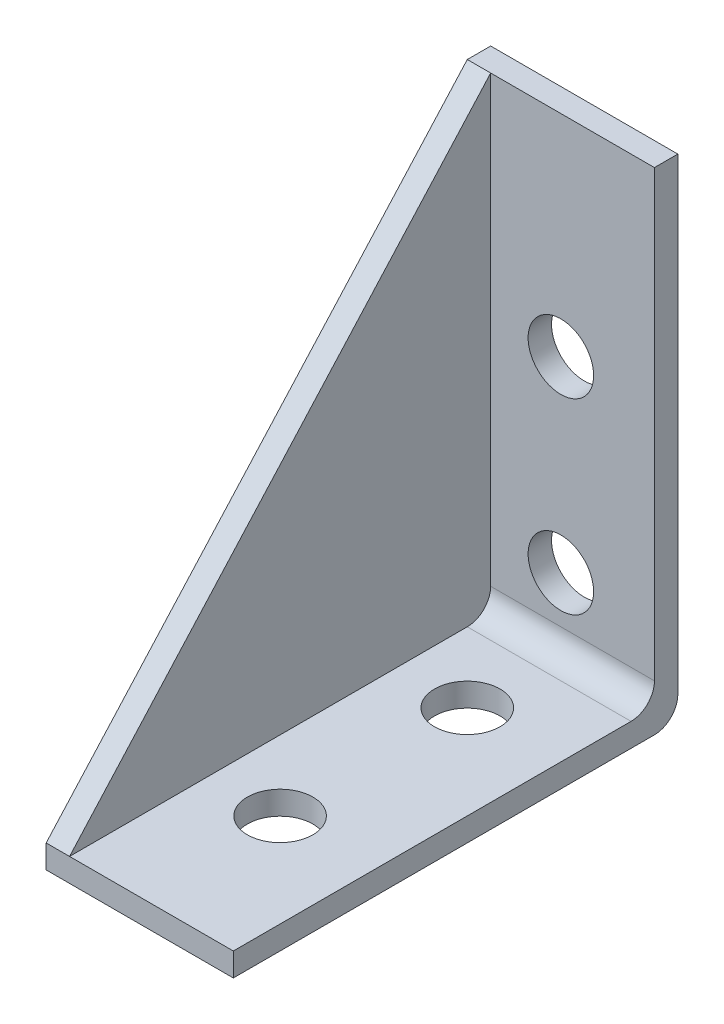
ISO-10303-21;
HEADER;
FILE_DESCRIPTION(('STEP AP214'),'2;1');
FILE_NAME('part.step','',(''),(''),'','','');
FILE_SCHEMA(('AUTOMOTIVE_DESIGN { 1 0 10303 214 1 1 1 1 }'));
ENDSEC;
DATA;
#1=APPLICATION_CONTEXT('core data for automotive mechanical design processes');
#2=APPLICATION_PROTOCOL_DEFINITION('international standard','automotive_design',2000,#1);
#3=PRODUCT_CONTEXT('',#1,'mechanical');
#4=PRODUCT('Part','Part','',(#3));
#5=PRODUCT_RELATED_PRODUCT_CATEGORY('part','',(#4));
#6=PRODUCT_DEFINITION_FORMATION('','',#4);
#7=PRODUCT_DEFINITION_CONTEXT('part definition',#1,'design');
#8=PRODUCT_DEFINITION('design','',#6,#7);
#9=PRODUCT_DEFINITION_SHAPE('','',#8);
#10=(LENGTH_UNIT() NAMED_UNIT(*) SI_UNIT(.MILLI.,.METRE.));
#11=(NAMED_UNIT(*) PLANE_ANGLE_UNIT() SI_UNIT($,.RADIAN.));
#12=(NAMED_UNIT(*) SI_UNIT($,.STERADIAN.) SOLID_ANGLE_UNIT());
#13=UNCERTAINTY_MEASURE_WITH_UNIT(LENGTH_MEASURE(1.E-05),#10,'distance_accuracy_value','');
#14=(GEOMETRIC_REPRESENTATION_CONTEXT(3) GLOBAL_UNCERTAINTY_ASSIGNED_CONTEXT((#13)) GLOBAL_UNIT_ASSIGNED_CONTEXT((#10,
#11,#12)) REPRESENTATION_CONTEXT('',''));
#15=CARTESIAN_POINT('',(0.,0.,0.));
#16=DIRECTION('',(0.,0.,1.));
#17=DIRECTION('',(1.,0.,0.));
#18=AXIS2_PLACEMENT_3D('',#15,#16,#17);
#19=CARTESIAN_POINT('',(0.,0.,5.));
#20=DIRECTION('',(0.,0.,-1.));
#21=DIRECTION('',(-1.,0.,0.));
#22=AXIS2_PLACEMENT_3D('',#19,#20,#21);
#23=PLANE('',#22);
#24=CARTESIAN_POINT('',(20.,20.,5.));
#25=DIRECTION('',(0.,0.,1.));
#26=DIRECTION('',(1.,0.,0.));
#27=AXIS2_PLACEMENT_3D('',#24,#25,#26);
#28=CIRCLE('',#27,7.);
#29=CARTESIAN_POINT('',(27.,20.,5.));
#30=VERTEX_POINT('',#29);
#31=EDGE_CURVE('E254',#30,#30,#28,.T.);
#32=ORIENTED_EDGE('',*,*,#31,.F.);
#33=EDGE_LOOP('',(#32));
#34=FACE_BOUND('',#33,.T.);
#35=CARTESIAN_POINT('',(20.,60.,5.));
#36=DIRECTION('',(0.,0.,1.));
#37=DIRECTION('',(1.,0.,0.));
#38=AXIS2_PLACEMENT_3D('',#35,#36,#37);
#39=CIRCLE('',#38,7.);
#40=CARTESIAN_POINT('',(27.,60.,5.));
#41=VERTEX_POINT('',#40);
#42=EDGE_CURVE('E259',#41,#41,#39,.T.);
#43=ORIENTED_EDGE('',*,*,#42,.F.);
#44=EDGE_LOOP('',(#43));
#45=FACE_BOUND('',#44,.T.);
#46=DIRECTION('',(0.,-1.,0.));
#47=VECTOR('',#46,1.);
#48=CARTESIAN_POINT('',(4.99999999999992,105.,5.));
#49=LINE('',#48,#47);
#50=CARTESIAN_POINT('',(4.99999999999992,105.,5.));
#51=VERTEX_POINT('',#50);
#52=CARTESIAN_POINT('',(4.99999999999995,10.,5.00000000000001));
#53=VERTEX_POINT('',#52);
#54=EDGE_CURVE('E118',#51,#53,#49,.T.);
#55=ORIENTED_EDGE('',*,*,#54,.T.);
#56=DIRECTION('',(-1.,0.,0.));
#57=VECTOR('',#56,1.);
#58=CARTESIAN_POINT('',(40.,10.,5.));
#59=LINE('',#58,#57);
#60=CARTESIAN_POINT('',(40.,10.,5.));
#61=VERTEX_POINT('',#60);
#62=EDGE_CURVE('E131',#53,#61,#59,.F.);
#63=ORIENTED_EDGE('',*,*,#62,.T.);
#64=DIRECTION('',(0.,1.,0.));
#65=VECTOR('',#64,1.);
#66=CARTESIAN_POINT('',(40.,0.,5.));
#67=LINE('',#66,#65);
#68=CARTESIAN_POINT('',(40.,105.,5.));
#69=VERTEX_POINT('',#68);
#70=EDGE_CURVE('E182',#61,#69,#67,.T.);
#71=ORIENTED_EDGE('',*,*,#70,.T.);
#72=DIRECTION('',(1.,0.,0.));
#73=VECTOR('',#72,1.);
#74=CARTESIAN_POINT('',(0.,105.,5.));
#75=LINE('',#74,#73);
#76=EDGE_CURVE('E133',#51,#69,#75,.T.);
#77=ORIENTED_EDGE('',*,*,#76,.F.);
#78=EDGE_LOOP('',(#55,#63,#71,#77));
#79=FACE_BOUND('',#78,.T.);
#80=ADVANCED_FACE('F45',(#34,#45,#79),#23,.F.);
#81=CARTESIAN_POINT('',(0.,5.,95.));
#82=DIRECTION('',(0.,-1.,0.));
#83=DIRECTION('',(0.,0.,-1.));
#84=AXIS2_PLACEMENT_3D('',#81,#82,#83);
#85=PLANE('',#84);
#86=CARTESIAN_POINT('',(20.,5.,25.));
#87=DIRECTION('',(0.,1.,0.));
#88=DIRECTION('',(0.,0.,1.));
#89=AXIS2_PLACEMENT_3D('',#86,#87,#88);
#90=CIRCLE('',#89,7.);
#91=CARTESIAN_POINT('',(20.,4.99999999999999,32.));
#92=VERTEX_POINT('',#91);
#93=EDGE_CURVE('E231',#92,#92,#90,.T.);
#94=ORIENTED_EDGE('',*,*,#93,.F.);
#95=EDGE_LOOP('',(#94));
#96=FACE_BOUND('',#95,.T.);
#97=CARTESIAN_POINT('',(20.,5.,65.));
#98=DIRECTION('',(0.,1.,0.));
#99=DIRECTION('',(0.,0.,1.));
#100=AXIS2_PLACEMENT_3D('',#97,#98,#99);
#101=CIRCLE('',#100,7.);
#102=CARTESIAN_POINT('',(20.,4.99999999999999,72.));
#103=VERTEX_POINT('',#102);
#104=EDGE_CURVE('E223',#103,#103,#101,.T.);
#105=ORIENTED_EDGE('',*,*,#104,.F.);
#106=EDGE_LOOP('',(#105));
#107=FACE_BOUND('',#106,.T.);
#108=DIRECTION('',(0.,0.,1.));
#109=VECTOR('',#108,1.);
#110=CARTESIAN_POINT('',(4.99999999999995,5.,95.));
#111=LINE('',#110,#109);
#112=CARTESIAN_POINT('',(4.99999999999995,5.,10.));
#113=VERTEX_POINT('',#112);
#114=CARTESIAN_POINT('',(4.99999999999995,5.,95.));
#115=VERTEX_POINT('',#114);
#116=EDGE_CURVE('E121',#113,#115,#111,.T.);
#117=ORIENTED_EDGE('',*,*,#116,.T.);
#118=DIRECTION('',(-1.,0.,0.));
#119=VECTOR('',#118,1.);
#120=CARTESIAN_POINT('',(0.,5.,95.));
#121=LINE('',#120,#119);
#122=CARTESIAN_POINT('',(40.,5.,95.));
#123=VERTEX_POINT('',#122);
#124=EDGE_CURVE('E244',#123,#115,#121,.T.);
#125=ORIENTED_EDGE('',*,*,#124,.F.);
#126=DIRECTION('',(0.,0.,-1.));
#127=VECTOR('',#126,1.);
#128=CARTESIAN_POINT('',(40.,5.,95.));
#129=LINE('',#128,#127);
#130=CARTESIAN_POINT('',(40.,5.,10.));
#131=VERTEX_POINT('',#130);
#132=EDGE_CURVE('E250',#123,#131,#129,.T.);
#133=ORIENTED_EDGE('',*,*,#132,.T.);
#134=DIRECTION('',(-1.,0.,0.));
#135=VECTOR('',#134,1.);
#136=CARTESIAN_POINT('',(0.,5.,9.99999999999999));
#137=LINE('',#136,#135);
#138=EDGE_CURVE('E142',#131,#113,#137,.T.);
#139=ORIENTED_EDGE('',*,*,#138,.T.);
#140=EDGE_LOOP('',(#117,#125,#133,#139));
#141=FACE_BOUND('',#140,.T.);
#142=ADVANCED_FACE('F272',(#96,#107,#141),#85,.F.);
#143=CARTESIAN_POINT('',(0.,10.,9.99999999999999));
#144=DIRECTION('',(1.,0.,0.));
#145=DIRECTION('',(0.,0.,-1.));
#146=AXIS2_PLACEMENT_3D('',#143,#144,#145);
#147=CYLINDRICAL_SURFACE('',#146,5.);
#148=CARTESIAN_POINT('',(4.99999999999995,10.,10.));
#149=DIRECTION('',(-1.,0.,0.));
#150=DIRECTION('',(0.,-1.,0.));
#151=AXIS2_PLACEMENT_3D('',#148,#149,#150);
#152=CIRCLE('',#151,5.00000000000001);
#153=EDGE_CURVE('E114',#53,#113,#152,.T.);
#154=ORIENTED_EDGE('',*,*,#153,.T.);
#155=ORIENTED_EDGE('',*,*,#138,.F.);
#156=CARTESIAN_POINT('',(40.,10.,9.99999999999999));
#157=DIRECTION('',(-1.,0.,0.));
#158=DIRECTION('',(0.,-1.,0.));
#159=AXIS2_PLACEMENT_3D('',#156,#157,#158);
#160=CIRCLE('',#159,5.);
#161=EDGE_CURVE('E140',#61,#131,#160,.T.);
#162=ORIENTED_EDGE('',*,*,#161,.F.);
#163=ORIENTED_EDGE('',*,*,#62,.F.);
#164=EDGE_LOOP('',(#154,#155,#162,#163));
#165=FACE_BOUND('',#164,.T.);
#166=ADVANCED_FACE('F139',(#165),#147,.F.);
#167=CARTESIAN_POINT('',(0.,0.,5.));
#168=DIRECTION('',(-1.,0.,0.));
#169=DIRECTION('',(0.,-1.,0.));
#170=AXIS2_PLACEMENT_3D('',#167,#168,#169);
#171=PLANE('',#170);
#172=DIRECTION('',(0.,0.743294146247166,-0.66896473162245));
#173=VECTOR('',#172,1.);
#174=CARTESIAN_POINT('',(0.,105.,5.));
#175=LINE('',#174,#173);
#176=CARTESIAN_POINT('',(0.,5.,95.));
#177=VERTEX_POINT('',#176);
#178=CARTESIAN_POINT('',(0.,105.,5.));
#179=VERTEX_POINT('',#178);
#180=EDGE_CURVE('E136',#177,#179,#175,.T.);
#181=ORIENTED_EDGE('',*,*,#180,.T.);
#182=DIRECTION('',(0.,0.,-1.));
#183=VECTOR('',#182,1.);
#184=CARTESIAN_POINT('',(0.,105.,5.));
#185=LINE('',#184,#183);
#186=CARTESIAN_POINT('',(0.,105.,0.));
#187=VERTEX_POINT('',#186);
#188=EDGE_CURVE('E177',#179,#187,#185,.T.);
#189=ORIENTED_EDGE('',*,*,#188,.T.);
#190=DIRECTION('',(0.,1.,0.));
#191=VECTOR('',#190,1.);
#192=CARTESIAN_POINT('',(0.,0.,0.));
#193=LINE('',#192,#191);
#194=CARTESIAN_POINT('',(0.,5.,0.));
#195=VERTEX_POINT('',#194);
#196=EDGE_CURVE('E195',#195,#187,#193,.T.);
#197=ORIENTED_EDGE('',*,*,#196,.F.);
#198=CARTESIAN_POINT('',(0.,5.,5.));
#199=DIRECTION('',(-1.,0.,0.));
#200=DIRECTION('',(0.,-1.,0.));
#201=AXIS2_PLACEMENT_3D('',#198,#199,#200);
#202=CIRCLE('',#201,5.);
#203=CARTESIAN_POINT('',(0.,0.,5.));
#204=VERTEX_POINT('',#203);
#205=EDGE_CURVE('E11',#195,#204,#202,.T.);
#206=ORIENTED_EDGE('',*,*,#205,.T.);
#207=DIRECTION('',(0.,0.,-1.));
#208=VECTOR('',#207,1.);
#209=CARTESIAN_POINT('',(0.,0.,5.));
#210=LINE('',#209,#208);
#211=CARTESIAN_POINT('',(0.,0.,95.));
#212=VERTEX_POINT('',#211);
#213=EDGE_CURVE('E148',#212,#204,#210,.T.);
#214=ORIENTED_EDGE('',*,*,#213,.F.);
#215=DIRECTION('',(0.,-1.,0.));
#216=VECTOR('',#215,1.);
#217=CARTESIAN_POINT('',(0.,0.,95.));
#218=LINE('',#217,#216);
#219=EDGE_CURVE('E214',#177,#212,#218,.T.);
#220=ORIENTED_EDGE('',*,*,#219,.F.);
#221=EDGE_LOOP('',(#181,#189,#197,#206,#214,#220));
#222=FACE_BOUND('',#221,.T.);
#223=ADVANCED_FACE('F212',(#222),#171,.T.);
#224=CARTESIAN_POINT('',(0.,0.,5.));
#225=DIRECTION('',(0.,1.,0.));
#226=DIRECTION('',(0.,0.,1.));
#227=AXIS2_PLACEMENT_3D('',#224,#225,#226);
#228=PLANE('',#227);
#229=CARTESIAN_POINT('',(20.,0.,65.));
#230=DIRECTION('',(0.,1.,0.));
#231=DIRECTION('',(0.,0.,1.));
#232=AXIS2_PLACEMENT_3D('',#229,#230,#231);
#233=CIRCLE('',#232,7.);
#234=CARTESIAN_POINT('',(20.,0.,72.));
#235=VERTEX_POINT('',#234);
#236=EDGE_CURVE('E227',#235,#235,#233,.T.);
#237=ORIENTED_EDGE('',*,*,#236,.T.);
#238=EDGE_LOOP('',(#237));
#239=FACE_BOUND('',#238,.T.);
#240=CARTESIAN_POINT('',(20.,0.,25.));
#241=DIRECTION('',(0.,1.,0.));
#242=DIRECTION('',(0.,0.,1.));
#243=AXIS2_PLACEMENT_3D('',#240,#241,#242);
#244=CIRCLE('',#243,7.);
#245=CARTESIAN_POINT('',(20.,0.,32.));
#246=VERTEX_POINT('',#245);
#247=EDGE_CURVE('E235',#246,#246,#244,.T.);
#248=ORIENTED_EDGE('',*,*,#247,.T.);
#249=EDGE_LOOP('',(#248));
#250=FACE_BOUND('',#249,.T.);
#251=ORIENTED_EDGE('',*,*,#213,.T.);
#252=DIRECTION('',(1.,0.,0.));
#253=VECTOR('',#252,1.);
#254=CARTESIAN_POINT('',(40.,0.,5.));
#255=LINE('',#254,#253);
#256=CARTESIAN_POINT('',(40.,0.,5.));
#257=VERTEX_POINT('',#256);
#258=EDGE_CURVE('E146',#204,#257,#255,.T.);
#259=ORIENTED_EDGE('',*,*,#258,.T.);
#260=DIRECTION('',(0.,0.,-1.));
#261=VECTOR('',#260,1.);
#262=CARTESIAN_POINT('',(40.,0.,5.));
#263=LINE('',#262,#261);
#264=CARTESIAN_POINT('',(40.,0.,95.));
#265=VERTEX_POINT('',#264);
#266=EDGE_CURVE('E162',#265,#257,#263,.T.);
#267=ORIENTED_EDGE('',*,*,#266,.F.);
#268=DIRECTION('',(1.,0.,0.));
#269=VECTOR('',#268,1.);
#270=CARTESIAN_POINT('',(40.,0.,95.));
#271=LINE('',#270,#269);
#272=EDGE_CURVE('E239',#212,#265,#271,.T.);
#273=ORIENTED_EDGE('',*,*,#272,.F.);
#274=EDGE_LOOP('',(#251,#259,#267,#273));
#275=FACE_BOUND('',#274,.T.);
#276=ADVANCED_FACE('F160',(#239,#250,#275),#228,.F.);
#277=CARTESIAN_POINT('',(40.,0.,5.));
#278=DIRECTION('',(-1.,0.,0.));
#279=DIRECTION('',(0.,-1.,0.));
#280=AXIS2_PLACEMENT_3D('',#277,#278,#279);
#281=PLANE('',#280);
#282=ORIENTED_EDGE('',*,*,#266,.T.);
#283=CARTESIAN_POINT('',(40.,5.,5.));
#284=DIRECTION('',(-1.,0.,0.));
#285=DIRECTION('',(0.,-1.,0.));
#286=AXIS2_PLACEMENT_3D('',#283,#284,#285);
#287=CIRCLE('',#286,5.);
#288=CARTESIAN_POINT('',(40.,5.,0.));
#289=VERTEX_POINT('',#288);
#290=EDGE_CURVE('E68',#257,#289,#287,.F.);
#291=ORIENTED_EDGE('',*,*,#290,.T.);
#292=DIRECTION('',(0.,1.,0.));
#293=VECTOR('',#292,1.);
#294=CARTESIAN_POINT('',(40.,0.,0.));
#295=LINE('',#294,#293);
#296=CARTESIAN_POINT('',(40.,105.,0.));
#297=VERTEX_POINT('',#296);
#298=EDGE_CURVE('E202',#289,#297,#295,.T.);
#299=ORIENTED_EDGE('',*,*,#298,.T.);
#300=DIRECTION('',(0.,0.,-1.));
#301=VECTOR('',#300,1.);
#302=CARTESIAN_POINT('',(40.,105.,5.));
#303=LINE('',#302,#301);
#304=EDGE_CURVE('E171',#69,#297,#303,.T.);
#305=ORIENTED_EDGE('',*,*,#304,.F.);
#306=ORIENTED_EDGE('',*,*,#70,.F.);
#307=ORIENTED_EDGE('',*,*,#161,.T.);
#308=ORIENTED_EDGE('',*,*,#132,.F.);
#309=DIRECTION('',(0.,1.,0.));
#310=VECTOR('',#309,1.);
#311=CARTESIAN_POINT('',(40.,5.,95.));
#312=LINE('',#311,#310);
#313=EDGE_CURVE('E168',#265,#123,#312,.T.);
#314=ORIENTED_EDGE('',*,*,#313,.F.);
#315=EDGE_LOOP('',(#282,#291,#299,#305,#306,#307,#308,#314));
#316=FACE_BOUND('',#315,.T.);
#317=ADVANCED_FACE('F166',(#316),#281,.F.);
#318=CARTESIAN_POINT('',(0.,105.,5.));
#319=DIRECTION('',(0.,1.,0.));
#320=DIRECTION('',(0.,0.,1.));
#321=AXIS2_PLACEMENT_3D('',#318,#319,#320);
#322=PLANE('',#321);
#323=DIRECTION('',(1.,0.,0.));
#324=VECTOR('',#323,1.);
#325=CARTESIAN_POINT('',(0.,105.,0.));
#326=LINE('',#325,#324);
#327=EDGE_CURVE('E198',#187,#297,#326,.T.);
#328=ORIENTED_EDGE('',*,*,#327,.F.);
#329=ORIENTED_EDGE('',*,*,#188,.F.);
#330=EDGE_CURVE('E188',#179,#51,#75,.T.);
#331=ORIENTED_EDGE('',*,*,#330,.T.);
#332=ORIENTED_EDGE('',*,*,#76,.T.);
#333=ORIENTED_EDGE('',*,*,#304,.T.);
#334=EDGE_LOOP('',(#328,#329,#331,#332,#333));
#335=FACE_BOUND('',#334,.T.);
#336=ADVANCED_FACE('F206',(#335),#322,.T.);
#337=CARTESIAN_POINT('',(0.,0.,0.));
#338=DIRECTION('',(0.,0.,-1.));
#339=DIRECTION('',(-1.,0.,0.));
#340=AXIS2_PLACEMENT_3D('',#337,#338,#339);
#341=PLANE('',#340);
#342=CARTESIAN_POINT('',(20.,20.,0.));
#343=DIRECTION('',(0.,0.,1.));
#344=DIRECTION('',(1.,0.,0.));
#345=AXIS2_PLACEMENT_3D('',#342,#343,#344);
#346=CIRCLE('',#345,7.);
#347=CARTESIAN_POINT('',(27.,20.,0.));
#348=VERTEX_POINT('',#347);
#349=EDGE_CURVE('E255',#348,#348,#346,.T.);
#350=ORIENTED_EDGE('',*,*,#349,.T.);
#351=EDGE_LOOP('',(#350));
#352=FACE_BOUND('',#351,.T.);
#353=CARTESIAN_POINT('',(20.,60.,0.));
#354=DIRECTION('',(0.,0.,1.));
#355=DIRECTION('',(1.,0.,0.));
#356=AXIS2_PLACEMENT_3D('',#353,#354,#355);
#357=CIRCLE('',#356,7.);
#358=CARTESIAN_POINT('',(27.,60.,0.));
#359=VERTEX_POINT('',#358);
#360=EDGE_CURVE('E199',#359,#359,#357,.T.);
#361=ORIENTED_EDGE('',*,*,#360,.T.);
#362=EDGE_LOOP('',(#361));
#363=FACE_BOUND('',#362,.T.);
#364=ORIENTED_EDGE('',*,*,#298,.F.);
#365=DIRECTION('',(1.,0.,0.));
#366=VECTOR('',#365,1.);
#367=CARTESIAN_POINT('',(0.,5.,0.));
#368=LINE('',#367,#366);
#369=EDGE_CURVE('E54',#289,#195,#368,.F.);
#370=ORIENTED_EDGE('',*,*,#369,.T.);
#371=ORIENTED_EDGE('',*,*,#196,.T.);
#372=ORIENTED_EDGE('',*,*,#327,.T.);
#373=EDGE_LOOP('',(#364,#370,#371,#372));
#374=FACE_BOUND('',#373,.T.);
#375=ADVANCED_FACE('F285',(#352,#363,#374),#341,.T.);
#376=CARTESIAN_POINT('',(20.,60.,0.));
#377=DIRECTION('',(0.,0.,1.));
#378=DIRECTION('',(1.,0.,0.));
#379=AXIS2_PLACEMENT_3D('',#376,#377,#378);
#380=CYLINDRICAL_SURFACE('',#379,7.);
#381=ORIENTED_EDGE('',*,*,#360,.F.);
#382=EDGE_LOOP('',(#381));
#383=FACE_BOUND('',#382,.T.);
#384=ORIENTED_EDGE('',*,*,#42,.T.);
#385=EDGE_LOOP('',(#384));
#386=FACE_BOUND('',#385,.T.);
#387=ADVANCED_FACE('F269',(#383,#386),#380,.F.);
#388=CARTESIAN_POINT('',(20.,20.,0.));
#389=DIRECTION('',(0.,0.,1.));
#390=DIRECTION('',(1.,0.,0.));
#391=AXIS2_PLACEMENT_3D('',#388,#389,#390);
#392=CYLINDRICAL_SURFACE('',#391,7.);
#393=ORIENTED_EDGE('',*,*,#349,.F.);
#394=EDGE_LOOP('',(#393));
#395=FACE_BOUND('',#394,.T.);
#396=ORIENTED_EDGE('',*,*,#31,.T.);
#397=EDGE_LOOP('',(#396));
#398=FACE_BOUND('',#397,.T.);
#399=ADVANCED_FACE('F324',(#395,#398),#392,.F.);
#400=CARTESIAN_POINT('',(0.,0.,95.));
#401=DIRECTION('',(0.,0.,-1.));
#402=DIRECTION('',(-1.,0.,0.));
#403=AXIS2_PLACEMENT_3D('',#400,#401,#402);
#404=PLANE('',#403);
#405=ORIENTED_EDGE('',*,*,#272,.T.);
#406=ORIENTED_EDGE('',*,*,#313,.T.);
#407=ORIENTED_EDGE('',*,*,#124,.T.);
#408=DIRECTION('',(-1.,0.,0.));
#409=VECTOR('',#408,1.);
#410=CARTESIAN_POINT('',(4.99999999999995,5.,95.));
#411=LINE('',#410,#409);
#412=EDGE_CURVE('E220',#115,#177,#411,.T.);
#413=ORIENTED_EDGE('',*,*,#412,.T.);
#414=ORIENTED_EDGE('',*,*,#219,.T.);
#415=EDGE_LOOP('',(#405,#406,#407,#413,#414));
#416=FACE_BOUND('',#415,.T.);
#417=ADVANCED_FACE('F319',(#416),#404,.F.);
#418=CARTESIAN_POINT('',(20.,-85.,25.));
#419=DIRECTION('',(0.,1.,0.));
#420=DIRECTION('',(0.,0.,1.));
#421=AXIS2_PLACEMENT_3D('',#418,#419,#420);
#422=CYLINDRICAL_SURFACE('',#421,7.);
#423=CARTESIAN_POINT('',(20.,4.99999999999999,32.));
#424=CARTESIAN_POINT('',(20.,4.94791666666666,32.));
#425=CARTESIAN_POINT('',(20.,4.89583333333333,32.));
#426=CARTESIAN_POINT('',(20.,4.79166666666666,32.));
#427=CARTESIAN_POINT('',(20.,4.73958333333333,32.));
#428=CARTESIAN_POINT('',(20.,4.63541666666666,32.));
#429=CARTESIAN_POINT('',(20.,4.58333333333332,32.));
#430=CARTESIAN_POINT('',(20.,4.47916666666665,32.));
#431=CARTESIAN_POINT('',(20.,4.42708333333332,32.));
#432=CARTESIAN_POINT('',(20.,4.32291666666666,32.));
#433=CARTESIAN_POINT('',(20.,4.27083333333333,32.));
#434=CARTESIAN_POINT('',(20.,4.16666666666666,32.));
#435=CARTESIAN_POINT('',(20.,4.11458333333332,32.));
#436=CARTESIAN_POINT('',(20.,4.01041666666665,32.));
#437=CARTESIAN_POINT('',(20.,3.95833333333332,32.));
#438=CARTESIAN_POINT('',(20.,3.85416666666665,32.));
#439=CARTESIAN_POINT('',(20.,3.80208333333332,32.));
#440=CARTESIAN_POINT('',(20.,3.69791666666666,32.));
#441=CARTESIAN_POINT('',(20.,3.64583333333333,32.));
#442=CARTESIAN_POINT('',(20.,3.54166666666666,32.));
#443=CARTESIAN_POINT('',(20.,3.48958333333333,32.));
#444=CARTESIAN_POINT('',(20.,3.38541666666666,32.));
#445=CARTESIAN_POINT('',(20.,3.33333333333332,32.));
#446=CARTESIAN_POINT('',(20.,3.22916666666665,32.));
#447=CARTESIAN_POINT('',(20.,3.17708333333332,32.));
#448=CARTESIAN_POINT('',(20.,3.07291666666666,32.));
#449=CARTESIAN_POINT('',(20.,3.02083333333332,32.));
#450=CARTESIAN_POINT('',(20.,2.91666666666666,32.));
#451=CARTESIAN_POINT('',(20.,2.86458333333332,32.));
#452=CARTESIAN_POINT('',(20.,2.76041666666665,32.));
#453=CARTESIAN_POINT('',(20.,2.70833333333332,32.));
#454=CARTESIAN_POINT('',(20.,2.60416666666665,32.));
#455=CARTESIAN_POINT('',(20.,2.55208333333332,32.));
#456=CARTESIAN_POINT('',(20.,2.44791666666666,32.));
#457=CARTESIAN_POINT('',(20.,2.39583333333332,32.));
#458=CARTESIAN_POINT('',(20.,2.29166666666666,32.));
#459=CARTESIAN_POINT('',(20.,2.23958333333333,32.));
#460=CARTESIAN_POINT('',(20.,2.13541666666666,32.));
#461=CARTESIAN_POINT('',(20.,2.08333333333332,32.));
#462=CARTESIAN_POINT('',(20.,1.97916666666665,32.));
#463=CARTESIAN_POINT('',(20.,1.92708333333332,32.));
#464=CARTESIAN_POINT('',(20.,1.82291666666666,32.));
#465=CARTESIAN_POINT('',(20.,1.77083333333332,32.));
#466=CARTESIAN_POINT('',(20.,1.66666666666665,32.));
#467=CARTESIAN_POINT('',(20.,1.61458333333332,32.));
#468=CARTESIAN_POINT('',(20.,1.51041666666665,32.));
#469=CARTESIAN_POINT('',(20.,1.45833333333332,32.));
#470=CARTESIAN_POINT('',(20.,1.35416666666665,32.));
#471=CARTESIAN_POINT('',(20.,1.30208333333332,32.));
#472=CARTESIAN_POINT('',(20.,1.19791666666665,32.));
#473=CARTESIAN_POINT('',(20.,1.14583333333332,32.));
#474=CARTESIAN_POINT('',(20.,1.04166666666666,32.));
#475=CARTESIAN_POINT('',(20.,0.989583333333326,32.));
#476=CARTESIAN_POINT('',(20.,0.885416666666657,32.));
#477=CARTESIAN_POINT('',(20.,0.83333333333332,32.));
#478=CARTESIAN_POINT('',(20.,0.729166666666651,32.));
#479=CARTESIAN_POINT('',(20.,0.677083333333319,32.));
#480=CARTESIAN_POINT('',(20.,0.572916666666654,32.));
#481=CARTESIAN_POINT('',(20.,0.520833333333322,32.));
#482=CARTESIAN_POINT('',(20.,0.416666666666653,32.));
#483=CARTESIAN_POINT('',(20.,0.364583333333316,32.));
#484=CARTESIAN_POINT('',(20.,0.260416666666647,32.));
#485=CARTESIAN_POINT('',(20.,0.208333333333315,32.));
#486=CARTESIAN_POINT('',(20.,0.104166666666651,32.));
#487=CARTESIAN_POINT('',(20.,0.0520833333333183,32.));
#488=CARTESIAN_POINT('',(20.,0.,32.));
#489=B_SPLINE_CURVE_WITH_KNOTS('',3,(#423,#424,#425,#426,#427,#428,#429,#430,#431,#432,#433,
#434,#435,#436,#437,#438,#439,#440,#441,#442,#443,#444,#445,#446,#447,#448,#449,#450,#451,#452,
#453,#454,#455,#456,#457,#458,#459,#460,#461,#462,#463,#464,#465,#466,#467,#468,#469,#470,#471,
#472,#473,#474,#475,#476,#477,#478,#479,#480,#481,#482,#483,#484,#485,#486,#487,#488),
.UNSPECIFIED.,.F.,.F.,(4,2,2,2,2,2,2,2,2,2,2,2,2,2,2,2,2,2,2,2,2,2,2,2,2,2,2,2,2,2,2,2,4),(0.,
0.156249999999997,0.312499999999993,0.468750000000004,0.625000000000001,0.781249999999997,
0.937500000000008,1.09375,1.25,1.40625,1.56249999999999,1.71875,1.875,2.03125,2.18750000000001,
2.34375000000001,2.5,2.65625,2.8125,2.96875000000001,3.125,3.28125,3.43750000000001,
3.59375000000001,3.75,3.90625,4.0625,4.21875000000001,4.375,4.53125,4.68750000000001,
4.84375000000001,5.),.UNSPECIFIED.);
#490=EDGE_CURVE('BSEAM323',#92,#246,#489,.T.);
#491=ORIENTED_EDGE('',*,*,#93,.T.);
#492=ORIENTED_EDGE('',*,*,#247,.F.);
#493=ORIENTED_EDGE('',*,*,#490,.T.);
#494=ORIENTED_EDGE('',*,*,#490,.F.);
#495=EDGE_LOOP('',(#491,#493,#492,#494));
#496=FACE_BOUND('',#495,.T.);
#497=ADVANCED_FACE('F323',(#496),#422,.F.);
#498=CARTESIAN_POINT('',(20.,-85.,65.));
#499=DIRECTION('',(0.,1.,0.));
#500=DIRECTION('',(0.,0.,1.));
#501=AXIS2_PLACEMENT_3D('',#498,#499,#500);
#502=CYLINDRICAL_SURFACE('',#501,7.);
#503=CARTESIAN_POINT('',(20.,4.99999999999999,72.));
#504=CARTESIAN_POINT('',(20.,4.94791666666666,72.));
#505=CARTESIAN_POINT('',(20.,4.89583333333333,72.));
#506=CARTESIAN_POINT('',(20.,4.79166666666666,72.));
#507=CARTESIAN_POINT('',(20.,4.73958333333333,72.));
#508=CARTESIAN_POINT('',(20.,4.63541666666666,72.));
#509=CARTESIAN_POINT('',(20.,4.58333333333332,72.));
#510=CARTESIAN_POINT('',(20.,4.47916666666665,72.));
#511=CARTESIAN_POINT('',(20.,4.42708333333332,72.));
#512=CARTESIAN_POINT('',(20.,4.32291666666666,72.));
#513=CARTESIAN_POINT('',(20.,4.27083333333333,72.));
#514=CARTESIAN_POINT('',(20.,4.16666666666666,72.));
#515=CARTESIAN_POINT('',(20.,4.11458333333332,72.));
#516=CARTESIAN_POINT('',(20.,4.01041666666665,72.));
#517=CARTESIAN_POINT('',(20.,3.95833333333332,72.));
#518=CARTESIAN_POINT('',(20.,3.85416666666665,72.));
#519=CARTESIAN_POINT('',(20.,3.80208333333332,72.));
#520=CARTESIAN_POINT('',(20.,3.69791666666666,72.));
#521=CARTESIAN_POINT('',(20.,3.64583333333333,72.));
#522=CARTESIAN_POINT('',(20.,3.54166666666666,72.));
#523=CARTESIAN_POINT('',(20.,3.48958333333333,72.));
#524=CARTESIAN_POINT('',(20.,3.38541666666666,72.));
#525=CARTESIAN_POINT('',(20.,3.33333333333332,72.));
#526=CARTESIAN_POINT('',(20.,3.22916666666665,72.));
#527=CARTESIAN_POINT('',(20.,3.17708333333332,72.));
#528=CARTESIAN_POINT('',(20.,3.07291666666666,72.));
#529=CARTESIAN_POINT('',(20.,3.02083333333332,72.));
#530=CARTESIAN_POINT('',(20.,2.91666666666666,72.));
#531=CARTESIAN_POINT('',(20.,2.86458333333332,72.));
#532=CARTESIAN_POINT('',(20.,2.76041666666665,72.));
#533=CARTESIAN_POINT('',(20.,2.70833333333332,72.));
#534=CARTESIAN_POINT('',(20.,2.60416666666665,72.));
#535=CARTESIAN_POINT('',(20.,2.55208333333332,72.));
#536=CARTESIAN_POINT('',(20.,2.44791666666666,72.));
#537=CARTESIAN_POINT('',(20.,2.39583333333332,72.));
#538=CARTESIAN_POINT('',(20.,2.29166666666666,72.));
#539=CARTESIAN_POINT('',(20.,2.23958333333333,72.));
#540=CARTESIAN_POINT('',(20.,2.13541666666666,72.));
#541=CARTESIAN_POINT('',(20.,2.08333333333332,72.));
#542=CARTESIAN_POINT('',(20.,1.97916666666665,72.));
#543=CARTESIAN_POINT('',(20.,1.92708333333332,72.));
#544=CARTESIAN_POINT('',(20.,1.82291666666666,72.));
#545=CARTESIAN_POINT('',(20.,1.77083333333332,72.));
#546=CARTESIAN_POINT('',(20.,1.66666666666665,72.));
#547=CARTESIAN_POINT('',(20.,1.61458333333332,72.));
#548=CARTESIAN_POINT('',(20.,1.51041666666665,72.));
#549=CARTESIAN_POINT('',(20.,1.45833333333332,72.));
#550=CARTESIAN_POINT('',(20.,1.35416666666665,72.));
#551=CARTESIAN_POINT('',(20.,1.30208333333332,72.));
#552=CARTESIAN_POINT('',(20.,1.19791666666665,72.));
#553=CARTESIAN_POINT('',(20.,1.14583333333332,72.));
#554=CARTESIAN_POINT('',(20.,1.04166666666666,72.));
#555=CARTESIAN_POINT('',(20.,0.989583333333326,72.));
#556=CARTESIAN_POINT('',(20.,0.885416666666657,72.));
#557=CARTESIAN_POINT('',(20.,0.83333333333332,72.));
#558=CARTESIAN_POINT('',(20.,0.729166666666651,72.));
#559=CARTESIAN_POINT('',(20.,0.677083333333319,72.));
#560=CARTESIAN_POINT('',(20.,0.572916666666654,72.));
#561=CARTESIAN_POINT('',(20.,0.520833333333322,72.));
#562=CARTESIAN_POINT('',(20.,0.416666666666653,72.));
#563=CARTESIAN_POINT('',(20.,0.364583333333316,72.));
#564=CARTESIAN_POINT('',(20.,0.260416666666647,72.));
#565=CARTESIAN_POINT('',(20.,0.208333333333315,72.));
#566=CARTESIAN_POINT('',(20.,0.104166666666651,72.));
#567=CARTESIAN_POINT('',(20.,0.0520833333333183,72.));
#568=CARTESIAN_POINT('',(20.,0.,72.));
#569=B_SPLINE_CURVE_WITH_KNOTS('',3,(#503,#504,#505,#506,#507,#508,#509,#510,#511,#512,#513,
#514,#515,#516,#517,#518,#519,#520,#521,#522,#523,#524,#525,#526,#527,#528,#529,#530,#531,#532,
#533,#534,#535,#536,#537,#538,#539,#540,#541,#542,#543,#544,#545,#546,#547,#548,#549,#550,#551,
#552,#553,#554,#555,#556,#557,#558,#559,#560,#561,#562,#563,#564,#565,#566,#567,#568),
.UNSPECIFIED.,.F.,.F.,(4,2,2,2,2,2,2,2,2,2,2,2,2,2,2,2,2,2,2,2,2,2,2,2,2,2,2,2,2,2,2,2,4),(0.,
0.156249999999997,0.312499999999993,0.468750000000004,0.625000000000001,0.781249999999997,
0.937500000000008,1.09375,1.25,1.40625,1.56249999999999,1.71875,1.875,2.03125,2.18750000000001,
2.34375000000001,2.5,2.65625,2.8125,2.96875000000001,3.125,3.28125,3.43750000000001,
3.59375000000001,3.75,3.90625,4.0625,4.21875000000001,4.375,4.53125,4.68750000000001,
4.84375000000001,5.),.UNSPECIFIED.);
#570=EDGE_CURVE('BSEAM360',#103,#235,#569,.T.);
#571=ORIENTED_EDGE('',*,*,#104,.T.);
#572=ORIENTED_EDGE('',*,*,#236,.F.);
#573=ORIENTED_EDGE('',*,*,#570,.T.);
#574=ORIENTED_EDGE('',*,*,#570,.F.);
#575=EDGE_LOOP('',(#571,#573,#572,#574));
#576=FACE_BOUND('',#575,.T.);
#577=ADVANCED_FACE('F360',(#576),#502,.F.);
#578=CARTESIAN_POINT('',(0.,5.,5.));
#579=DIRECTION('',(-1.,0.,0.));
#580=DIRECTION('',(0.,0.,1.));
#581=AXIS2_PLACEMENT_3D('',#578,#579,#580);
#582=CYLINDRICAL_SURFACE('',#581,5.);
#583=ORIENTED_EDGE('',*,*,#205,.F.);
#584=ORIENTED_EDGE('',*,*,#369,.F.);
#585=ORIENTED_EDGE('',*,*,#290,.F.);
#586=ORIENTED_EDGE('',*,*,#258,.F.);
#587=EDGE_LOOP('',(#583,#584,#585,#586));
#588=FACE_BOUND('',#587,.T.);
#589=ADVANCED_FACE('F47',(#588),#582,.T.);
#590=CARTESIAN_POINT('',(4.99999999999992,105.,5.));
#591=DIRECTION('',(0.,0.66896473162245,0.743294146247166));
#592=DIRECTION('',(0.,-0.743294146247166,0.66896473162245));
#593=AXIS2_PLACEMENT_3D('',#590,#591,#592);
#594=PLANE('',#593);
#595=ORIENTED_EDGE('',*,*,#180,.F.);
#596=ORIENTED_EDGE('',*,*,#412,.F.);
#597=DIRECTION('',(0.,0.743294146247166,-0.66896473162245));
#598=VECTOR('',#597,1.);
#599=CARTESIAN_POINT('',(4.99999999999992,105.,5.));
#600=LINE('',#599,#598);
#601=EDGE_CURVE('E210',#115,#51,#600,.T.);
#602=ORIENTED_EDGE('',*,*,#601,.T.);
#603=ORIENTED_EDGE('',*,*,#330,.F.);
#604=EDGE_LOOP('',(#595,#596,#602,#603));
#605=FACE_BOUND('',#604,.T.);
#606=ADVANCED_FACE('F208',(#605),#594,.T.);
#607=CARTESIAN_POINT('',(4.99999999999995,10.,10.));
#608=DIRECTION('',(-1.,0.,0.));
#609=DIRECTION('',(0.,-1.,0.));
#610=AXIS2_PLACEMENT_3D('',#607,#608,#609);
#611=PLANE('',#610);
#612=ORIENTED_EDGE('',*,*,#54,.F.);
#613=ORIENTED_EDGE('',*,*,#601,.F.);
#614=ORIENTED_EDGE('',*,*,#116,.F.);
#615=ORIENTED_EDGE('',*,*,#153,.F.);
#616=EDGE_LOOP('',(#612,#613,#614,#615));
#617=FACE_BOUND('',#616,.T.);
#618=ADVANCED_FACE('F116',(#617),#611,.F.);
#619=CLOSED_SHELL('',(#80,#142,#166,#223,#276,#317,#336,#375,#387,#399,#417,#497,#577,#589,#606,#618));
#620=MANIFOLD_SOLID_BREP('B2',#619);
#621=ADVANCED_BREP_SHAPE_REPRESENTATION('',(#18,#620),#14);
#622=SHAPE_DEFINITION_REPRESENTATION(#9,#621);
ENDSEC;
END-ISO-10303-21;
